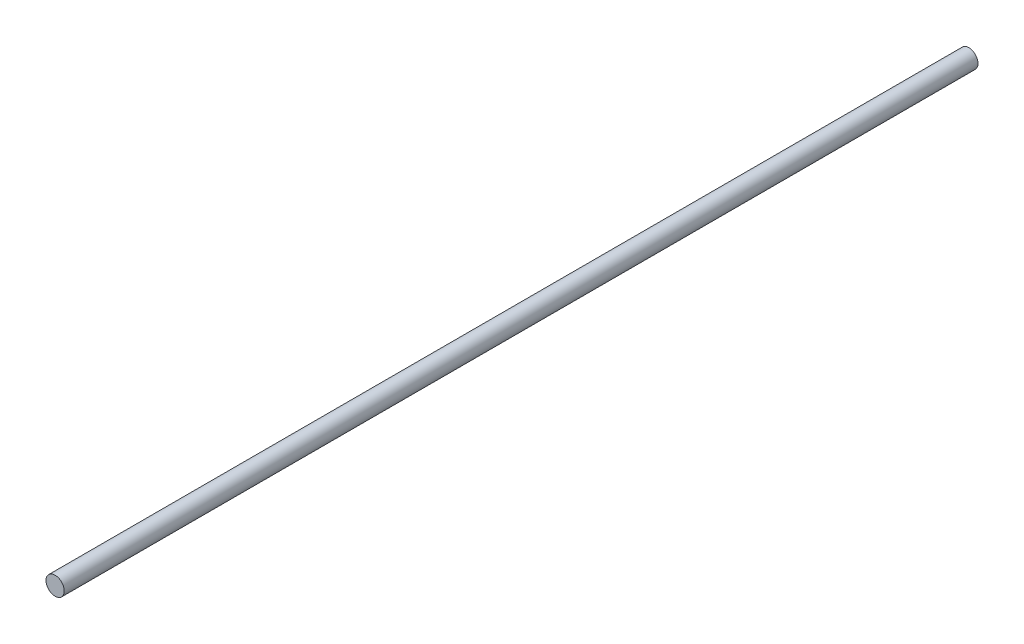
ISO-10303-21;
HEADER;
FILE_DESCRIPTION(('STEP AP214'),'2;1');
FILE_NAME('part.step','',(''),(''),'','','');
FILE_SCHEMA(('AUTOMOTIVE_DESIGN { 1 0 10303 214 1 1 1 1 }'));
ENDSEC;
DATA;
#1=APPLICATION_CONTEXT('core data for automotive mechanical design processes');
#2=APPLICATION_PROTOCOL_DEFINITION('international standard','automotive_design',2000,#1);
#3=PRODUCT_CONTEXT('',#1,'mechanical');
#4=PRODUCT('Part','Part','',(#3));
#5=PRODUCT_RELATED_PRODUCT_CATEGORY('part','',(#4));
#6=PRODUCT_DEFINITION_FORMATION('','',#4);
#7=PRODUCT_DEFINITION_CONTEXT('part definition',#1,'design');
#8=PRODUCT_DEFINITION('design','',#6,#7);
#9=PRODUCT_DEFINITION_SHAPE('','',#8);
#10=(LENGTH_UNIT() NAMED_UNIT(*) SI_UNIT(.MILLI.,.METRE.));
#11=(NAMED_UNIT(*) PLANE_ANGLE_UNIT() SI_UNIT($,.RADIAN.));
#12=(NAMED_UNIT(*) SI_UNIT($,.STERADIAN.) SOLID_ANGLE_UNIT());
#13=UNCERTAINTY_MEASURE_WITH_UNIT(LENGTH_MEASURE(1.E-05),#10,'distance_accuracy_value','');
#14=(GEOMETRIC_REPRESENTATION_CONTEXT(3) GLOBAL_UNCERTAINTY_ASSIGNED_CONTEXT((#13)) GLOBAL_UNIT_ASSIGNED_CONTEXT((#10,
#11,#12)) REPRESENTATION_CONTEXT('',''));
#15=CARTESIAN_POINT('',(0.,0.,0.));
#16=DIRECTION('',(0.,0.,1.));
#17=DIRECTION('',(1.,0.,0.));
#18=AXIS2_PLACEMENT_3D('',#15,#16,#17);
#19=CARTESIAN_POINT('',(-68.9315892766379,-191.22665222084,-40.));
#20=DIRECTION('',(0.,0.,1.));
#21=DIRECTION('',(1.,0.,0.));
#22=AXIS2_PLACEMENT_3D('',#19,#20,#21);
#23=CYLINDRICAL_SURFACE('',#22,0.399999999999995);
#24=CARTESIAN_POINT('',(-68.9315892766379,-191.22665222084,-40.));
#25=DIRECTION('',(0.,0.,1.));
#26=DIRECTION('',(1.,0.,0.));
#27=AXIS2_PLACEMENT_3D('',#24,#25,#26);
#28=CIRCLE('',#27,0.399999999999995);
#29=CARTESIAN_POINT('',(-68.5315892766379,-191.22665222084,-40.));
#30=VERTEX_POINT('',#29);
#31=EDGE_CURVE('E10',#30,#30,#28,.T.);
#32=ORIENTED_EDGE('',*,*,#31,.T.);
#33=EDGE_LOOP('',(#32));
#34=FACE_BOUND('',#33,.T.);
#35=CARTESIAN_POINT('',(-68.9315892766379,-191.22665222084,0.));
#36=DIRECTION('',(0.,0.,1.));
#37=DIRECTION('',(1.,0.,0.));
#38=AXIS2_PLACEMENT_3D('',#35,#36,#37);
#39=CIRCLE('',#38,0.399999999999995);
#40=CARTESIAN_POINT('',(-68.5315892766379,-191.22665222084,0.));
#41=VERTEX_POINT('',#40);
#42=EDGE_CURVE('E34',#41,#41,#39,.T.);
#43=ORIENTED_EDGE('',*,*,#42,.F.);
#44=EDGE_LOOP('',(#43));
#45=FACE_BOUND('',#44,.T.);
#46=ADVANCED_FACE('F31',(#34,#45),#23,.T.);
#47=CARTESIAN_POINT('',(-68.9315892766379,-191.22665222084,-40.));
#48=DIRECTION('',(0.,0.,1.));
#49=DIRECTION('',(1.,0.,0.));
#50=AXIS2_PLACEMENT_3D('',#47,#48,#49);
#51=PLANE('',#50);
#52=ORIENTED_EDGE('',*,*,#31,.F.);
#53=EDGE_LOOP('',(#52));
#54=FACE_BOUND('',#53,.T.);
#55=ADVANCED_FACE('F46',(#54),#51,.F.);
#56=CARTESIAN_POINT('',(-68.9315892766379,-191.22665222084,0.));
#57=DIRECTION('',(0.,0.,1.));
#58=DIRECTION('',(1.,0.,0.));
#59=AXIS2_PLACEMENT_3D('',#56,#57,#58);
#60=PLANE('',#59);
#61=ORIENTED_EDGE('',*,*,#42,.T.);
#62=EDGE_LOOP('',(#61));
#63=FACE_BOUND('',#62,.T.);
#64=ADVANCED_FACE('F43',(#63),#60,.T.);
#65=CLOSED_SHELL('',(#46,#55,#64));
#66=MANIFOLD_SOLID_BREP('B2',#65);
#67=ADVANCED_BREP_SHAPE_REPRESENTATION('',(#18,#66),#14);
#68=SHAPE_DEFINITION_REPRESENTATION(#9,#67);
ENDSEC;
END-ISO-10303-21;
